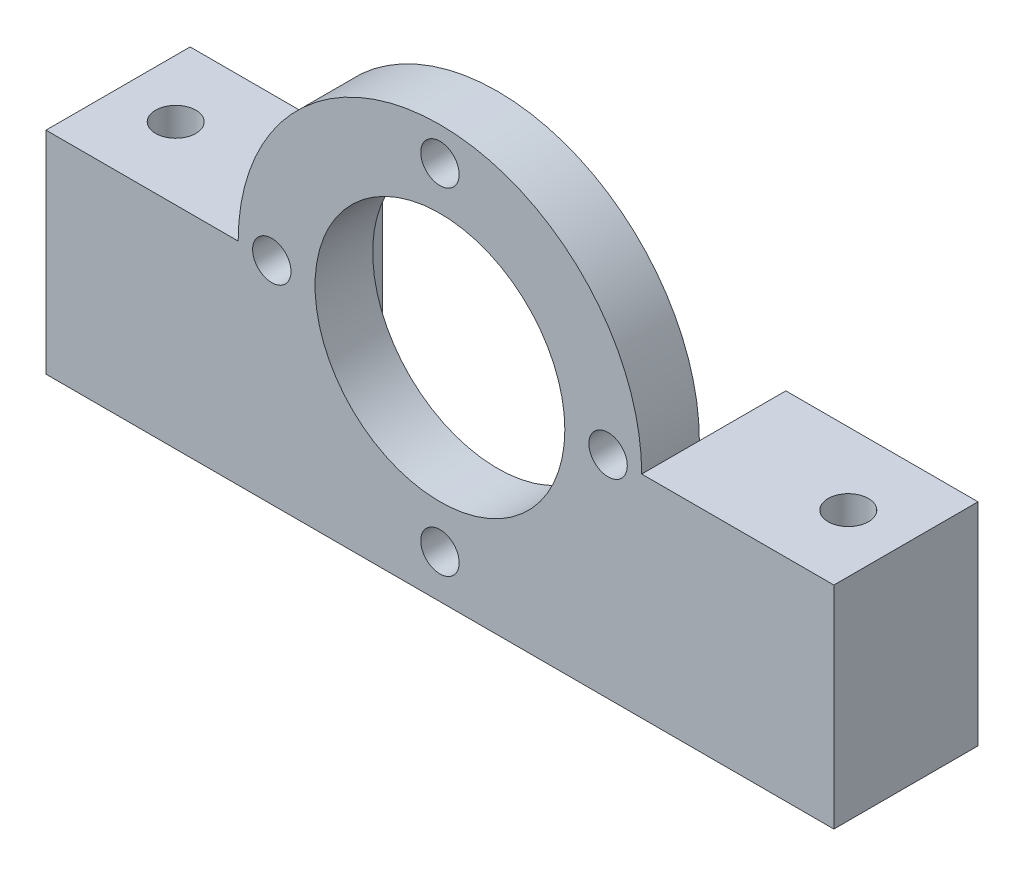
ISO-10303-21;
HEADER;
FILE_DESCRIPTION(('STEP AP214'),'2;1');
FILE_NAME('part.step','',(''),(''),'','','');
FILE_SCHEMA(('AUTOMOTIVE_DESIGN { 1 0 10303 214 1 1 1 1 }'));
ENDSEC;
DATA;
#1=APPLICATION_CONTEXT('core data for automotive mechanical design processes');
#2=APPLICATION_PROTOCOL_DEFINITION('international standard','automotive_design',2000,#1);
#3=PRODUCT_CONTEXT('',#1,'mechanical');
#4=PRODUCT('Part','Part','',(#3));
#5=PRODUCT_RELATED_PRODUCT_CATEGORY('part','',(#4));
#6=PRODUCT_DEFINITION_FORMATION('','',#4);
#7=PRODUCT_DEFINITION_CONTEXT('part definition',#1,'design');
#8=PRODUCT_DEFINITION('design','',#6,#7);
#9=PRODUCT_DEFINITION_SHAPE('','',#8);
#10=(LENGTH_UNIT() NAMED_UNIT(*) SI_UNIT(.MILLI.,.METRE.));
#11=(NAMED_UNIT(*) PLANE_ANGLE_UNIT() SI_UNIT($,.RADIAN.));
#12=(NAMED_UNIT(*) SI_UNIT($,.STERADIAN.) SOLID_ANGLE_UNIT());
#13=UNCERTAINTY_MEASURE_WITH_UNIT(LENGTH_MEASURE(1.E-05),#10,'distance_accuracy_value','');
#14=(GEOMETRIC_REPRESENTATION_CONTEXT(3) GLOBAL_UNCERTAINTY_ASSIGNED_CONTEXT((#13)) GLOBAL_UNIT_ASSIGNED_CONTEXT((#10,
#11,#12)) REPRESENTATION_CONTEXT('',''));
#15=CARTESIAN_POINT('',(0.,0.,0.));
#16=DIRECTION('',(0.,0.,1.));
#17=DIRECTION('',(1.,0.,0.));
#18=AXIS2_PLACEMENT_3D('',#15,#16,#17);
#19=CARTESIAN_POINT('',(0.,22.,6.));
#20=DIRECTION('',(0.,0.,1.));
#21=DIRECTION('',(1.,0.,0.));
#22=AXIS2_PLACEMENT_3D('',#19,#20,#21);
#23=PLANE('',#22);
#24=CARTESIAN_POINT('',(0.,4.5,6.));
#25=DIRECTION('',(0.,0.,1.));
#26=DIRECTION('',(1.,0.,0.));
#27=AXIS2_PLACEMENT_3D('',#24,#25,#26);
#28=CIRCLE('',#27,2.);
#29=CARTESIAN_POINT('',(2.,4.5,6.));
#30=VERTEX_POINT('',#29);
#31=EDGE_CURVE('E178',#30,#30,#28,.T.);
#32=ORIENTED_EDGE('',*,*,#31,.F.);
#33=EDGE_LOOP('',(#32));
#34=FACE_BOUND('',#33,.T.);
#35=CARTESIAN_POINT('',(0.,39.5,6.));
#36=DIRECTION('',(0.,0.,1.));
#37=DIRECTION('',(1.,0.,0.));
#38=AXIS2_PLACEMENT_3D('',#35,#36,#37);
#39=CIRCLE('',#38,2.);
#40=CARTESIAN_POINT('',(2.,39.5,6.));
#41=VERTEX_POINT('',#40);
#42=EDGE_CURVE('E190',#41,#41,#39,.T.);
#43=ORIENTED_EDGE('',*,*,#42,.F.);
#44=EDGE_LOOP('',(#43));
#45=FACE_BOUND('',#44,.T.);
#46=CARTESIAN_POINT('',(0.,22.,6.));
#47=DIRECTION('',(0.,0.,1.));
#48=DIRECTION('',(1.,0.,0.));
#49=AXIS2_PLACEMENT_3D('',#46,#47,#48);
#50=CIRCLE('',#49,21.);
#51=CARTESIAN_POINT('',(21.,22.,6.));
#52=VERTEX_POINT('',#51);
#53=CARTESIAN_POINT('',(-21.,22.,6.));
#54=VERTEX_POINT('',#53);
#55=EDGE_CURVE('E119',#52,#54,#50,.T.);
#56=ORIENTED_EDGE('',*,*,#55,.T.);
#57=DIRECTION('',(-1.,0.,0.));
#58=VECTOR('',#57,1.);
#59=CARTESIAN_POINT('',(-41.,22.,6.));
#60=LINE('',#59,#58);
#61=CARTESIAN_POINT('',(-41.,22.,6.));
#62=VERTEX_POINT('',#61);
#63=EDGE_CURVE('E135',#54,#62,#60,.T.);
#64=ORIENTED_EDGE('',*,*,#63,.T.);
#65=DIRECTION('',(0.,-1.,0.));
#66=VECTOR('',#65,1.);
#67=CARTESIAN_POINT('',(-41.,22.,6.));
#68=LINE('',#67,#66);
#69=CARTESIAN_POINT('',(-41.,0.,6.));
#70=VERTEX_POINT('',#69);
#71=EDGE_CURVE('E116',#62,#70,#68,.T.);
#72=ORIENTED_EDGE('',*,*,#71,.T.);
#73=DIRECTION('',(1.,0.,0.));
#74=VECTOR('',#73,1.);
#75=CARTESIAN_POINT('',(-21.,0.,6.));
#76=LINE('',#75,#74);
#77=CARTESIAN_POINT('',(41.,0.,6.));
#78=VERTEX_POINT('',#77);
#79=EDGE_CURVE('E109',#70,#78,#76,.T.);
#80=ORIENTED_EDGE('',*,*,#79,.T.);
#81=DIRECTION('',(0.,1.,0.));
#82=VECTOR('',#81,1.);
#83=CARTESIAN_POINT('',(41.,22.,6.));
#84=LINE('',#83,#82);
#85=CARTESIAN_POINT('',(41.,22.,6.));
#86=VERTEX_POINT('',#85);
#87=EDGE_CURVE('E113',#78,#86,#84,.T.);
#88=ORIENTED_EDGE('',*,*,#87,.T.);
#89=DIRECTION('',(-1.,0.,0.));
#90=VECTOR('',#89,1.);
#91=CARTESIAN_POINT('',(41.,22.,6.));
#92=LINE('',#91,#90);
#93=EDGE_CURVE('E58',#86,#52,#92,.T.);
#94=ORIENTED_EDGE('',*,*,#93,.T.);
#95=EDGE_LOOP('',(#56,#64,#72,#80,#88,#94));
#96=FACE_BOUND('',#95,.T.);
#97=CARTESIAN_POINT('',(0.,22.,6.));
#98=DIRECTION('',(0.,0.,1.));
#99=DIRECTION('',(1.,0.,0.));
#100=AXIS2_PLACEMENT_3D('',#97,#98,#99);
#101=CIRCLE('',#100,13.);
#102=CARTESIAN_POINT('',(13.,22.,6.));
#103=VERTEX_POINT('',#102);
#104=EDGE_CURVE('E196',#103,#103,#101,.T.);
#105=ORIENTED_EDGE('',*,*,#104,.F.);
#106=EDGE_LOOP('',(#105));
#107=FACE_BOUND('',#106,.T.);
#108=CARTESIAN_POINT('',(17.5,22.,6.));
#109=DIRECTION('',(0.,0.,1.));
#110=DIRECTION('',(1.,0.,0.));
#111=AXIS2_PLACEMENT_3D('',#108,#109,#110);
#112=CIRCLE('',#111,2.00000000000001);
#113=CARTESIAN_POINT('',(19.5,22.,6.));
#114=VERTEX_POINT('',#113);
#115=EDGE_CURVE('E184',#114,#114,#112,.T.);
#116=ORIENTED_EDGE('',*,*,#115,.F.);
#117=EDGE_LOOP('',(#116));
#118=FACE_BOUND('',#117,.T.);
#119=CARTESIAN_POINT('',(-17.5,22.,6.));
#120=DIRECTION('',(0.,0.,1.));
#121=DIRECTION('',(1.,0.,0.));
#122=AXIS2_PLACEMENT_3D('',#119,#120,#121);
#123=CIRCLE('',#122,2.);
#124=CARTESIAN_POINT('',(-15.5,22.,6.));
#125=VERTEX_POINT('',#124);
#126=EDGE_CURVE('E172',#125,#125,#123,.T.);
#127=ORIENTED_EDGE('',*,*,#126,.F.);
#128=EDGE_LOOP('',(#127));
#129=FACE_BOUND('',#128,.T.);
#130=ADVANCED_FACE('F43',(#34,#45,#96,#107,#118,#129),#23,.T.);
#131=CARTESIAN_POINT('',(0.,22.,0.));
#132=DIRECTION('',(0.,0.,1.));
#133=DIRECTION('',(1.,0.,0.));
#134=AXIS2_PLACEMENT_3D('',#131,#132,#133);
#135=PLANE('',#134);
#136=CARTESIAN_POINT('',(0.,22.,0.));
#137=DIRECTION('',(0.,0.,1.));
#138=DIRECTION('',(1.,0.,0.));
#139=AXIS2_PLACEMENT_3D('',#136,#137,#138);
#140=CIRCLE('',#139,21.);
#141=CARTESIAN_POINT('',(21.,22.,0.));
#142=VERTEX_POINT('',#141);
#143=CARTESIAN_POINT('',(-21.,22.,0.));
#144=VERTEX_POINT('',#143);
#145=EDGE_CURVE('E199',#142,#144,#140,.T.);
#146=ORIENTED_EDGE('',*,*,#145,.F.);
#147=DIRECTION('',(0.,1.,0.));
#148=VECTOR('',#147,1.);
#149=CARTESIAN_POINT('',(21.,0.,0.));
#150=LINE('',#149,#148);
#151=CARTESIAN_POINT('',(21.,0.,0.));
#152=VERTEX_POINT('',#151);
#153=EDGE_CURVE('E202',#152,#142,#150,.T.);
#154=ORIENTED_EDGE('',*,*,#153,.F.);
#155=DIRECTION('',(1.,0.,0.));
#156=VECTOR('',#155,1.);
#157=CARTESIAN_POINT('',(-21.,0.,0.));
#158=LINE('',#157,#156);
#159=CARTESIAN_POINT('',(-21.,0.,0.));
#160=VERTEX_POINT('',#159);
#161=EDGE_CURVE('E209',#160,#152,#158,.T.);
#162=ORIENTED_EDGE('',*,*,#161,.F.);
#163=DIRECTION('',(0.,-1.,0.));
#164=VECTOR('',#163,1.);
#165=CARTESIAN_POINT('',(-21.,22.,0.));
#166=LINE('',#165,#164);
#167=EDGE_CURVE('E206',#144,#160,#166,.T.);
#168=ORIENTED_EDGE('',*,*,#167,.F.);
#169=EDGE_LOOP('',(#146,#154,#162,#168));
#170=FACE_BOUND('',#169,.T.);
#171=CARTESIAN_POINT('',(0.,22.,0.));
#172=DIRECTION('',(0.,0.,1.));
#173=DIRECTION('',(1.,0.,0.));
#174=AXIS2_PLACEMENT_3D('',#171,#172,#173);
#175=CIRCLE('',#174,13.);
#176=CARTESIAN_POINT('',(13.,22.,0.));
#177=VERTEX_POINT('',#176);
#178=EDGE_CURVE('E193',#177,#177,#175,.T.);
#179=ORIENTED_EDGE('',*,*,#178,.T.);
#180=EDGE_LOOP('',(#179));
#181=FACE_BOUND('',#180,.T.);
#182=CARTESIAN_POINT('',(0.,39.5,0.));
#183=DIRECTION('',(0.,0.,1.));
#184=DIRECTION('',(1.,0.,0.));
#185=AXIS2_PLACEMENT_3D('',#182,#183,#184);
#186=CIRCLE('',#185,2.);
#187=CARTESIAN_POINT('',(2.,39.5,0.));
#188=VERTEX_POINT('',#187);
#189=EDGE_CURVE('E187',#188,#188,#186,.T.);
#190=ORIENTED_EDGE('',*,*,#189,.T.);
#191=EDGE_LOOP('',(#190));
#192=FACE_BOUND('',#191,.T.);
#193=CARTESIAN_POINT('',(17.5,22.,0.));
#194=DIRECTION('',(0.,0.,1.));
#195=DIRECTION('',(1.,0.,0.));
#196=AXIS2_PLACEMENT_3D('',#193,#194,#195);
#197=CIRCLE('',#196,2.00000000000001);
#198=CARTESIAN_POINT('',(19.5,22.,0.));
#199=VERTEX_POINT('',#198);
#200=EDGE_CURVE('E181',#199,#199,#197,.T.);
#201=ORIENTED_EDGE('',*,*,#200,.T.);
#202=EDGE_LOOP('',(#201));
#203=FACE_BOUND('',#202,.T.);
#204=CARTESIAN_POINT('',(0.,4.5,0.));
#205=DIRECTION('',(0.,0.,1.));
#206=DIRECTION('',(1.,0.,0.));
#207=AXIS2_PLACEMENT_3D('',#204,#205,#206);
#208=CIRCLE('',#207,2.);
#209=CARTESIAN_POINT('',(2.,4.5,0.));
#210=VERTEX_POINT('',#209);
#211=EDGE_CURVE('E175',#210,#210,#208,.T.);
#212=ORIENTED_EDGE('',*,*,#211,.T.);
#213=EDGE_LOOP('',(#212));
#214=FACE_BOUND('',#213,.T.);
#215=CARTESIAN_POINT('',(-17.5,22.,0.));
#216=DIRECTION('',(0.,0.,1.));
#217=DIRECTION('',(1.,0.,0.));
#218=AXIS2_PLACEMENT_3D('',#215,#216,#217);
#219=CIRCLE('',#218,2.);
#220=CARTESIAN_POINT('',(-15.5,22.,0.));
#221=VERTEX_POINT('',#220);
#222=EDGE_CURVE('E165',#221,#221,#219,.T.);
#223=ORIENTED_EDGE('',*,*,#222,.T.);
#224=EDGE_LOOP('',(#223));
#225=FACE_BOUND('',#224,.T.);
#226=ADVANCED_FACE('F221',(#170,#181,#192,#203,#214,#225),#135,.F.);
#227=CARTESIAN_POINT('',(0.,22.,6.));
#228=DIRECTION('',(0.,0.,-1.));
#229=DIRECTION('',(-1.,0.,0.));
#230=AXIS2_PLACEMENT_3D('',#227,#228,#229);
#231=CYLINDRICAL_SURFACE('',#230,21.);
#232=ORIENTED_EDGE('',*,*,#145,.T.);
#233=DIRECTION('',(0.,0.,-1.));
#234=VECTOR('',#233,1.);
#235=CARTESIAN_POINT('',(-21.,22.,6.));
#236=LINE('',#235,#234);
#237=EDGE_CURVE('E11',#54,#144,#236,.T.);
#238=ORIENTED_EDGE('',*,*,#237,.F.);
#239=ORIENTED_EDGE('',*,*,#55,.F.);
#240=DIRECTION('',(0.,0.,-1.));
#241=VECTOR('',#240,1.);
#242=CARTESIAN_POINT('',(21.,22.,6.));
#243=LINE('',#242,#241);
#244=EDGE_CURVE('E52',#52,#142,#243,.T.);
#245=ORIENTED_EDGE('',*,*,#244,.T.);
#246=EDGE_LOOP('',(#232,#238,#239,#245));
#247=FACE_BOUND('',#246,.T.);
#248=ADVANCED_FACE('F45',(#247),#231,.T.);
#249=CARTESIAN_POINT('',(-21.,0.,6.));
#250=DIRECTION('',(0.,1.,0.));
#251=DIRECTION('',(0.,0.,1.));
#252=AXIS2_PLACEMENT_3D('',#249,#250,#251);
#253=PLANE('',#252);
#254=CARTESIAN_POINT('',(-35.,0.,-1.5));
#255=DIRECTION('',(0.,1.,0.));
#256=DIRECTION('',(-1.,0.,0.));
#257=AXIS2_PLACEMENT_3D('',#254,#255,#256);
#258=CIRCLE('',#257,2.1);
#259=CARTESIAN_POINT('',(-37.1,0.,-1.5));
#260=VERTEX_POINT('',#259);
#261=EDGE_CURVE('E131',#260,#260,#258,.T.);
#262=ORIENTED_EDGE('',*,*,#261,.T.);
#263=EDGE_LOOP('',(#262));
#264=FACE_BOUND('',#263,.T.);
#265=CARTESIAN_POINT('',(35.,0.,-1.5));
#266=DIRECTION('',(0.,1.,0.));
#267=DIRECTION('',(1.,0.,0.));
#268=AXIS2_PLACEMENT_3D('',#265,#266,#267);
#269=CIRCLE('',#268,2.1);
#270=CARTESIAN_POINT('',(37.1,0.,-1.5));
#271=VERTEX_POINT('',#270);
#272=EDGE_CURVE('E248',#271,#271,#269,.T.);
#273=ORIENTED_EDGE('',*,*,#272,.T.);
#274=EDGE_LOOP('',(#273));
#275=FACE_BOUND('',#274,.T.);
#276=ORIENTED_EDGE('',*,*,#161,.T.);
#277=DIRECTION('',(0.,0.,1.));
#278=VECTOR('',#277,1.);
#279=CARTESIAN_POINT('',(21.,0.,-9.));
#280=LINE('',#279,#278);
#281=CARTESIAN_POINT('',(21.,0.,-9.));
#282=VERTEX_POINT('',#281);
#283=EDGE_CURVE('E130',#282,#152,#280,.T.);
#284=ORIENTED_EDGE('',*,*,#283,.F.);
#285=DIRECTION('',(1.,0.,0.));
#286=VECTOR('',#285,1.);
#287=CARTESIAN_POINT('',(41.,0.,-9.));
#288=LINE('',#287,#286);
#289=CARTESIAN_POINT('',(41.,0.,-9.));
#290=VERTEX_POINT('',#289);
#291=EDGE_CURVE('E126',#282,#290,#288,.T.);
#292=ORIENTED_EDGE('',*,*,#291,.T.);
#293=DIRECTION('',(0.,0.,1.));
#294=VECTOR('',#293,1.);
#295=CARTESIAN_POINT('',(41.,0.,-9.));
#296=LINE('',#295,#294);
#297=EDGE_CURVE('E122',#290,#78,#296,.T.);
#298=ORIENTED_EDGE('',*,*,#297,.T.);
#299=ORIENTED_EDGE('',*,*,#79,.F.);
#300=DIRECTION('',(0.,0.,1.));
#301=VECTOR('',#300,1.);
#302=CARTESIAN_POINT('',(-41.,0.,-9.));
#303=LINE('',#302,#301);
#304=CARTESIAN_POINT('',(-41.,0.,-9.));
#305=VERTEX_POINT('',#304);
#306=EDGE_CURVE('E166',#305,#70,#303,.T.);
#307=ORIENTED_EDGE('',*,*,#306,.F.);
#308=DIRECTION('',(1.,0.,0.));
#309=VECTOR('',#308,1.);
#310=CARTESIAN_POINT('',(-41.,0.,-9.));
#311=LINE('',#310,#309);
#312=CARTESIAN_POINT('',(-21.,0.,-9.));
#313=VERTEX_POINT('',#312);
#314=EDGE_CURVE('E158',#305,#313,#311,.T.);
#315=ORIENTED_EDGE('',*,*,#314,.T.);
#316=DIRECTION('',(0.,0.,1.));
#317=VECTOR('',#316,1.);
#318=CARTESIAN_POINT('',(-21.,0.,-9.));
#319=LINE('',#318,#317);
#320=EDGE_CURVE('E163',#313,#160,#319,.T.);
#321=ORIENTED_EDGE('',*,*,#320,.T.);
#322=EDGE_LOOP('',(#276,#284,#292,#298,#299,#307,#315,#321));
#323=FACE_BOUND('',#322,.T.);
#324=ADVANCED_FACE('F124',(#264,#275,#323),#253,.F.);
#325=CARTESIAN_POINT('',(0.,22.,6.));
#326=DIRECTION('',(0.,0.,-1.));
#327=DIRECTION('',(-1.,0.,0.));
#328=AXIS2_PLACEMENT_3D('',#325,#326,#327);
#329=CYLINDRICAL_SURFACE('',#328,13.);
#330=ORIENTED_EDGE('',*,*,#104,.T.);
#331=EDGE_LOOP('',(#330));
#332=FACE_BOUND('',#331,.T.);
#333=ORIENTED_EDGE('',*,*,#178,.F.);
#334=EDGE_LOOP('',(#333));
#335=FACE_BOUND('',#334,.T.);
#336=ADVANCED_FACE('F291',(#332,#335),#329,.F.);
#337=CARTESIAN_POINT('',(0.,39.5,6.));
#338=DIRECTION('',(0.,0.,-1.));
#339=DIRECTION('',(-1.,0.,0.));
#340=AXIS2_PLACEMENT_3D('',#337,#338,#339);
#341=CYLINDRICAL_SURFACE('',#340,2.);
#342=ORIENTED_EDGE('',*,*,#42,.T.);
#343=EDGE_LOOP('',(#342));
#344=FACE_BOUND('',#343,.T.);
#345=ORIENTED_EDGE('',*,*,#189,.F.);
#346=EDGE_LOOP('',(#345));
#347=FACE_BOUND('',#346,.T.);
#348=ADVANCED_FACE('F297',(#344,#347),#341,.F.);
#349=CARTESIAN_POINT('',(17.5,22.,6.));
#350=DIRECTION('',(0.,0.,-1.));
#351=DIRECTION('',(-1.,0.,0.));
#352=AXIS2_PLACEMENT_3D('',#349,#350,#351);
#353=CYLINDRICAL_SURFACE('',#352,2.00000000000001);
#354=ORIENTED_EDGE('',*,*,#115,.T.);
#355=EDGE_LOOP('',(#354));
#356=FACE_BOUND('',#355,.T.);
#357=ORIENTED_EDGE('',*,*,#200,.F.);
#358=EDGE_LOOP('',(#357));
#359=FACE_BOUND('',#358,.T.);
#360=ADVANCED_FACE('F395',(#356,#359),#353,.F.);
#361=CARTESIAN_POINT('',(0.,4.5,6.));
#362=DIRECTION('',(0.,0.,-1.));
#363=DIRECTION('',(-1.,0.,0.));
#364=AXIS2_PLACEMENT_3D('',#361,#362,#363);
#365=CYLINDRICAL_SURFACE('',#364,2.);
#366=ORIENTED_EDGE('',*,*,#31,.T.);
#367=EDGE_LOOP('',(#366));
#368=FACE_BOUND('',#367,.T.);
#369=ORIENTED_EDGE('',*,*,#211,.F.);
#370=EDGE_LOOP('',(#369));
#371=FACE_BOUND('',#370,.T.);
#372=ADVANCED_FACE('F385',(#368,#371),#365,.F.);
#373=CARTESIAN_POINT('',(-17.5,22.,6.));
#374=DIRECTION('',(0.,0.,-1.));
#375=DIRECTION('',(-1.,0.,0.));
#376=AXIS2_PLACEMENT_3D('',#373,#374,#375);
#377=CYLINDRICAL_SURFACE('',#376,2.);
#378=ORIENTED_EDGE('',*,*,#126,.T.);
#379=EDGE_LOOP('',(#378));
#380=FACE_BOUND('',#379,.T.);
#381=ORIENTED_EDGE('',*,*,#222,.F.);
#382=EDGE_LOOP('',(#381));
#383=FACE_BOUND('',#382,.T.);
#384=ADVANCED_FACE('F311',(#380,#383),#377,.F.);
#385=CARTESIAN_POINT('',(-21.,22.,-9.));
#386=DIRECTION('',(1.,0.,0.));
#387=DIRECTION('',(0.,0.,-1.));
#388=AXIS2_PLACEMENT_3D('',#385,#386,#387);
#389=PLANE('',#388);
#390=ORIENTED_EDGE('',*,*,#167,.T.);
#391=ORIENTED_EDGE('',*,*,#320,.F.);
#392=DIRECTION('',(0.,1.,0.));
#393=VECTOR('',#392,1.);
#394=CARTESIAN_POINT('',(-21.,22.,-9.));
#395=LINE('',#394,#393);
#396=CARTESIAN_POINT('',(-21.,22.,-9.));
#397=VERTEX_POINT('',#396);
#398=EDGE_CURVE('E149',#313,#397,#395,.T.);
#399=ORIENTED_EDGE('',*,*,#398,.T.);
#400=DIRECTION('',(0.,0.,1.));
#401=VECTOR('',#400,1.);
#402=CARTESIAN_POINT('',(-21.,22.,-9.));
#403=LINE('',#402,#401);
#404=EDGE_CURVE('E160',#397,#144,#403,.T.);
#405=ORIENTED_EDGE('',*,*,#404,.T.);
#406=EDGE_LOOP('',(#390,#391,#399,#405));
#407=FACE_BOUND('',#406,.T.);
#408=ADVANCED_FACE('F225',(#407),#389,.T.);
#409=CARTESIAN_POINT('',(-41.,22.,-9.));
#410=DIRECTION('',(-1.,0.,0.));
#411=DIRECTION('',(0.,0.,1.));
#412=AXIS2_PLACEMENT_3D('',#409,#410,#411);
#413=PLANE('',#412);
#414=ORIENTED_EDGE('',*,*,#71,.F.);
#415=DIRECTION('',(0.,0.,1.));
#416=VECTOR('',#415,1.);
#417=CARTESIAN_POINT('',(-41.,22.,-9.));
#418=LINE('',#417,#416);
#419=CARTESIAN_POINT('',(-41.,22.,-9.));
#420=VERTEX_POINT('',#419);
#421=EDGE_CURVE('E168',#420,#62,#418,.T.);
#422=ORIENTED_EDGE('',*,*,#421,.F.);
#423=DIRECTION('',(0.,-1.,0.));
#424=VECTOR('',#423,1.);
#425=CARTESIAN_POINT('',(-41.,22.,-9.));
#426=LINE('',#425,#424);
#427=EDGE_CURVE('E155',#420,#305,#426,.T.);
#428=ORIENTED_EDGE('',*,*,#427,.T.);
#429=ORIENTED_EDGE('',*,*,#306,.T.);
#430=EDGE_LOOP('',(#414,#422,#428,#429));
#431=FACE_BOUND('',#430,.T.);
#432=ADVANCED_FACE('F235',(#431),#413,.T.);
#433=CARTESIAN_POINT('',(-41.,22.,-9.));
#434=DIRECTION('',(0.,1.,0.));
#435=DIRECTION('',(0.,0.,1.));
#436=AXIS2_PLACEMENT_3D('',#433,#434,#435);
#437=PLANE('',#436);
#438=CARTESIAN_POINT('',(-35.,22.,-1.5));
#439=DIRECTION('',(0.,1.,0.));
#440=DIRECTION('',(-1.,0.,0.));
#441=AXIS2_PLACEMENT_3D('',#438,#439,#440);
#442=CIRCLE('',#441,2.1);
#443=CARTESIAN_POINT('',(-37.1,22.,-1.5));
#444=VERTEX_POINT('',#443);
#445=EDGE_CURVE('E254',#444,#444,#442,.T.);
#446=ORIENTED_EDGE('',*,*,#445,.F.);
#447=EDGE_LOOP('',(#446));
#448=FACE_BOUND('',#447,.T.);
#449=ORIENTED_EDGE('',*,*,#63,.F.);
#450=ORIENTED_EDGE('',*,*,#237,.T.);
#451=ORIENTED_EDGE('',*,*,#404,.F.);
#452=DIRECTION('',(-1.,0.,0.));
#453=VECTOR('',#452,1.);
#454=CARTESIAN_POINT('',(-41.,22.,-9.));
#455=LINE('',#454,#453);
#456=EDGE_CURVE('E152',#397,#420,#455,.T.);
#457=ORIENTED_EDGE('',*,*,#456,.T.);
#458=ORIENTED_EDGE('',*,*,#421,.T.);
#459=EDGE_LOOP('',(#449,#450,#451,#457,#458));
#460=FACE_BOUND('',#459,.T.);
#461=ADVANCED_FACE('F229',(#448,#460),#437,.T.);
#462=CARTESIAN_POINT('',(0.,0.,-9.));
#463=DIRECTION('',(0.,0.,1.));
#464=DIRECTION('',(1.,0.,0.));
#465=AXIS2_PLACEMENT_3D('',#462,#463,#464);
#466=PLANE('',#465);
#467=ORIENTED_EDGE('',*,*,#398,.F.);
#468=ORIENTED_EDGE('',*,*,#314,.F.);
#469=ORIENTED_EDGE('',*,*,#427,.F.);
#470=ORIENTED_EDGE('',*,*,#456,.F.);
#471=EDGE_LOOP('',(#467,#468,#469,#470));
#472=FACE_BOUND('',#471,.T.);
#473=ADVANCED_FACE('F232',(#472),#466,.F.);
#474=CARTESIAN_POINT('',(21.,22.,-9.));
#475=DIRECTION('',(-1.,0.,0.));
#476=DIRECTION('',(0.,0.,1.));
#477=AXIS2_PLACEMENT_3D('',#474,#475,#476);
#478=PLANE('',#477);
#479=ORIENTED_EDGE('',*,*,#153,.T.);
#480=DIRECTION('',(0.,0.,1.));
#481=VECTOR('',#480,1.);
#482=CARTESIAN_POINT('',(21.,22.,-9.));
#483=LINE('',#482,#481);
#484=CARTESIAN_POINT('',(21.,22.,-9.));
#485=VERTEX_POINT('',#484);
#486=EDGE_CURVE('E237',#485,#142,#483,.T.);
#487=ORIENTED_EDGE('',*,*,#486,.F.);
#488=DIRECTION('',(0.,-1.,0.));
#489=VECTOR('',#488,1.);
#490=CARTESIAN_POINT('',(21.,22.,-9.));
#491=LINE('',#490,#489);
#492=EDGE_CURVE('E142',#485,#282,#491,.T.);
#493=ORIENTED_EDGE('',*,*,#492,.T.);
#494=ORIENTED_EDGE('',*,*,#283,.T.);
#495=EDGE_LOOP('',(#479,#487,#493,#494));
#496=FACE_BOUND('',#495,.T.);
#497=ADVANCED_FACE('F240',(#496),#478,.T.);
#498=CARTESIAN_POINT('',(41.,22.,-9.));
#499=DIRECTION('',(1.,0.,0.));
#500=DIRECTION('',(0.,0.,-1.));
#501=AXIS2_PLACEMENT_3D('',#498,#499,#500);
#502=PLANE('',#501);
#503=ORIENTED_EDGE('',*,*,#87,.F.);
#504=ORIENTED_EDGE('',*,*,#297,.F.);
#505=DIRECTION('',(0.,1.,0.));
#506=VECTOR('',#505,1.);
#507=CARTESIAN_POINT('',(41.,22.,-9.));
#508=LINE('',#507,#506);
#509=CARTESIAN_POINT('',(41.,22.,-9.));
#510=VERTEX_POINT('',#509);
#511=EDGE_CURVE('E138',#290,#510,#508,.T.);
#512=ORIENTED_EDGE('',*,*,#511,.T.);
#513=DIRECTION('',(0.,0.,1.));
#514=VECTOR('',#513,1.);
#515=CARTESIAN_POINT('',(41.,22.,-9.));
#516=LINE('',#515,#514);
#517=EDGE_CURVE('E134',#510,#86,#516,.T.);
#518=ORIENTED_EDGE('',*,*,#517,.T.);
#519=EDGE_LOOP('',(#503,#504,#512,#518));
#520=FACE_BOUND('',#519,.T.);
#521=ADVANCED_FACE('F133',(#520),#502,.T.);
#522=CARTESIAN_POINT('',(41.,22.,-9.));
#523=DIRECTION('',(0.,1.,0.));
#524=DIRECTION('',(-1.,0.,0.));
#525=AXIS2_PLACEMENT_3D('',#522,#523,#524);
#526=PLANE('',#525);
#527=CARTESIAN_POINT('',(35.,22.,-1.5));
#528=DIRECTION('',(0.,1.,0.));
#529=DIRECTION('',(1.,0.,0.));
#530=AXIS2_PLACEMENT_3D('',#527,#528,#529);
#531=CIRCLE('',#530,2.1);
#532=CARTESIAN_POINT('',(37.1,22.,-1.5));
#533=VERTEX_POINT('',#532);
#534=EDGE_CURVE('E251',#533,#533,#531,.T.);
#535=ORIENTED_EDGE('',*,*,#534,.F.);
#536=EDGE_LOOP('',(#535));
#537=FACE_BOUND('',#536,.T.);
#538=ORIENTED_EDGE('',*,*,#93,.F.);
#539=ORIENTED_EDGE('',*,*,#517,.F.);
#540=DIRECTION('',(-1.,0.,0.));
#541=VECTOR('',#540,1.);
#542=CARTESIAN_POINT('',(41.,22.,-9.));
#543=LINE('',#542,#541);
#544=EDGE_CURVE('E145',#510,#485,#543,.T.);
#545=ORIENTED_EDGE('',*,*,#544,.T.);
#546=ORIENTED_EDGE('',*,*,#486,.T.);
#547=ORIENTED_EDGE('',*,*,#244,.F.);
#548=EDGE_LOOP('',(#538,#539,#545,#546,#547));
#549=FACE_BOUND('',#548,.T.);
#550=ADVANCED_FACE('F244',(#537,#549),#526,.T.);
#551=CARTESIAN_POINT('',(0.,0.,-9.));
#552=DIRECTION('',(0.,0.,-1.));
#553=DIRECTION('',(-1.,0.,0.));
#554=AXIS2_PLACEMENT_3D('',#551,#552,#553);
#555=PLANE('',#554);
#556=ORIENTED_EDGE('',*,*,#511,.F.);
#557=ORIENTED_EDGE('',*,*,#291,.F.);
#558=ORIENTED_EDGE('',*,*,#492,.F.);
#559=ORIENTED_EDGE('',*,*,#544,.F.);
#560=EDGE_LOOP('',(#556,#557,#558,#559));
#561=FACE_BOUND('',#560,.T.);
#562=ADVANCED_FACE('F243',(#561),#555,.T.);
#563=CARTESIAN_POINT('',(35.,0.,-1.5));
#564=DIRECTION('',(0.,1.,0.));
#565=DIRECTION('',(-1.,0.,0.));
#566=AXIS2_PLACEMENT_3D('',#563,#564,#565);
#567=CYLINDRICAL_SURFACE('',#566,2.1);
#568=ORIENTED_EDGE('',*,*,#272,.F.);
#569=EDGE_LOOP('',(#568));
#570=FACE_BOUND('',#569,.T.);
#571=ORIENTED_EDGE('',*,*,#534,.T.);
#572=EDGE_LOOP('',(#571));
#573=FACE_BOUND('',#572,.T.);
#574=ADVANCED_FACE('F265',(#570,#573),#567,.F.);
#575=CARTESIAN_POINT('',(-35.,0.,-1.5));
#576=DIRECTION('',(0.,1.,0.));
#577=DIRECTION('',(-1.,0.,0.));
#578=AXIS2_PLACEMENT_3D('',#575,#576,#577);
#579=CYLINDRICAL_SURFACE('',#578,2.1);
#580=ORIENTED_EDGE('',*,*,#261,.F.);
#581=EDGE_LOOP('',(#580));
#582=FACE_BOUND('',#581,.T.);
#583=ORIENTED_EDGE('',*,*,#445,.T.);
#584=EDGE_LOOP('',(#583));
#585=FACE_BOUND('',#584,.T.);
#586=ADVANCED_FACE('F262',(#582,#585),#579,.F.);
#587=CLOSED_SHELL('',(#130,#226,#248,#324,#336,#348,#360,#372,#384,#408,#432,#461,#473,#497,
#521,#550,#562,#574,#586));
#588=MANIFOLD_SOLID_BREP('B2',#587);
#589=ADVANCED_BREP_SHAPE_REPRESENTATION('',(#18,#588),#14);
#590=SHAPE_DEFINITION_REPRESENTATION(#9,#589);
ENDSEC;
END-ISO-10303-21;
